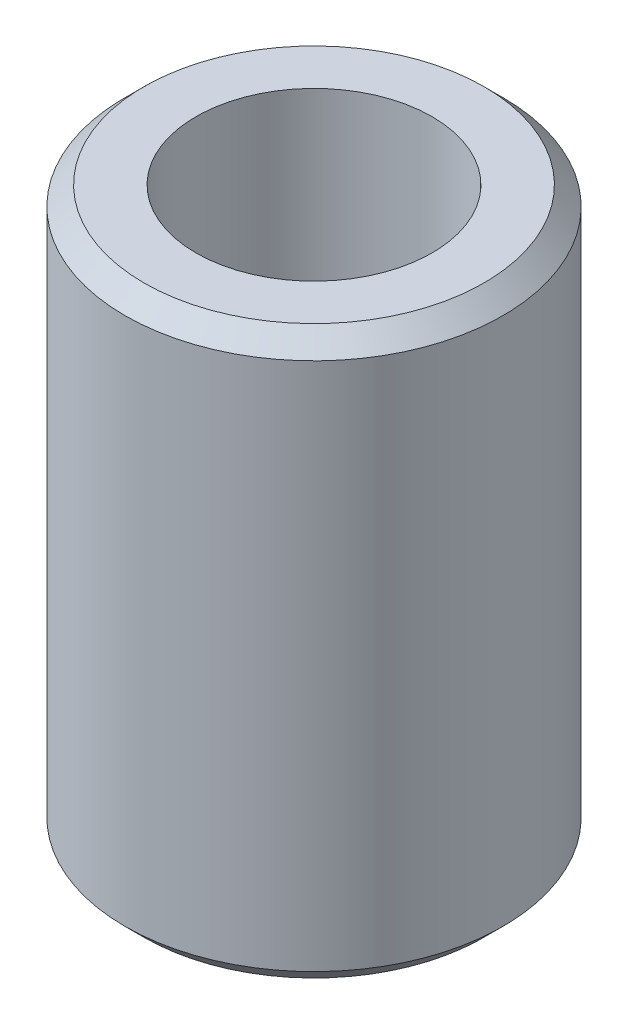
ISO-10303-21;
HEADER;
FILE_DESCRIPTION(('STEP AP214'),'2;1');
FILE_NAME('part.step','',(''),(''),'','','');
FILE_SCHEMA(('AUTOMOTIVE_DESIGN { 1 0 10303 214 1 1 1 1 }'));
ENDSEC;
DATA;
#1=APPLICATION_CONTEXT('core data for automotive mechanical design processes');
#2=APPLICATION_PROTOCOL_DEFINITION('international standard','automotive_design',2000,#1);
#3=PRODUCT_CONTEXT('',#1,'mechanical');
#4=PRODUCT('Part','Part','',(#3));
#5=PRODUCT_RELATED_PRODUCT_CATEGORY('part','',(#4));
#6=PRODUCT_DEFINITION_FORMATION('','',#4);
#7=PRODUCT_DEFINITION_CONTEXT('part definition',#1,'design');
#8=PRODUCT_DEFINITION('design','',#6,#7);
#9=PRODUCT_DEFINITION_SHAPE('','',#8);
#10=(LENGTH_UNIT() NAMED_UNIT(*) SI_UNIT(.MILLI.,.METRE.));
#11=(NAMED_UNIT(*) PLANE_ANGLE_UNIT() SI_UNIT($,.RADIAN.));
#12=(NAMED_UNIT(*) SI_UNIT($,.STERADIAN.) SOLID_ANGLE_UNIT());
#13=UNCERTAINTY_MEASURE_WITH_UNIT(LENGTH_MEASURE(1.E-05),#10,'distance_accuracy_value','');
#14=(GEOMETRIC_REPRESENTATION_CONTEXT(3) GLOBAL_UNCERTAINTY_ASSIGNED_CONTEXT((#13)) GLOBAL_UNIT_ASSIGNED_CONTEXT((#10,
#11,#12)) REPRESENTATION_CONTEXT('',''));
#15=CARTESIAN_POINT('',(0.,0.,0.));
#16=DIRECTION('',(0.,0.,1.));
#17=DIRECTION('',(1.,0.,0.));
#18=AXIS2_PLACEMENT_3D('',#15,#16,#17);
#19=CARTESIAN_POINT('',(0.,60.,0.));
#20=DIRECTION('',(0.,-1.,0.));
#21=DIRECTION('',(0.,0.,-1.));
#22=AXIS2_PLACEMENT_3D('',#19,#20,#21);
#23=CYLINDRICAL_SURFACE('',#22,20.);
#24=CARTESIAN_POINT('',(0.,2.,0.));
#25=DIRECTION('',(0.,1.,0.));
#26=DIRECTION('',(0.,0.,1.));
#27=AXIS2_PLACEMENT_3D('',#24,#25,#26);
#28=CIRCLE('',#27,20.);
#29=CARTESIAN_POINT('',(0.,2.,20.));
#30=VERTEX_POINT('',#29);
#31=EDGE_CURVE('E49',#30,#30,#28,.T.);
#32=ORIENTED_EDGE('',*,*,#31,.T.);
#33=EDGE_LOOP('',(#32));
#34=FACE_BOUND('',#33,.T.);
#35=CARTESIAN_POINT('',(0.,58.,0.));
#36=DIRECTION('',(0.,1.,0.));
#37=DIRECTION('',(0.,0.,1.));
#38=AXIS2_PLACEMENT_3D('',#35,#36,#37);
#39=CIRCLE('',#38,20.);
#40=CARTESIAN_POINT('',(0.,58.,20.));
#41=VERTEX_POINT('',#40);
#42=EDGE_CURVE('E53',#41,#41,#39,.F.);
#43=ORIENTED_EDGE('',*,*,#42,.T.);
#44=EDGE_LOOP('',(#43));
#45=FACE_BOUND('',#44,.T.);
#46=ADVANCED_FACE('F37',(#34,#45),#23,.T.);
#47=CARTESIAN_POINT('',(0.,60.,0.));
#48=DIRECTION('',(0.,1.,0.));
#49=DIRECTION('',(0.,0.,1.));
#50=AXIS2_PLACEMENT_3D('',#47,#48,#49);
#51=PLANE('',#50);
#52=CARTESIAN_POINT('',(0.,60.,0.));
#53=DIRECTION('',(0.,1.,0.));
#54=DIRECTION('',(0.,0.,1.));
#55=AXIS2_PLACEMENT_3D('',#52,#53,#54);
#56=CIRCLE('',#55,18.);
#57=CARTESIAN_POINT('',(0.,60.,18.));
#58=VERTEX_POINT('',#57);
#59=EDGE_CURVE('E10',#58,#58,#56,.T.);
#60=ORIENTED_EDGE('',*,*,#59,.T.);
#61=EDGE_LOOP('',(#60));
#62=FACE_BOUND('',#61,.T.);
#63=CARTESIAN_POINT('',(0.,60.,0.));
#64=DIRECTION('',(0.,1.,0.));
#65=DIRECTION('',(0.,0.,1.));
#66=AXIS2_PLACEMENT_3D('',#63,#64,#65);
#67=CIRCLE('',#66,12.5);
#68=CARTESIAN_POINT('',(0.,60.,12.5));
#69=VERTEX_POINT('',#68);
#70=EDGE_CURVE('E59',#69,#69,#67,.T.);
#71=ORIENTED_EDGE('',*,*,#70,.F.);
#72=EDGE_LOOP('',(#71));
#73=FACE_BOUND('',#72,.T.);
#74=ADVANCED_FACE('F74',(#62,#73),#51,.T.);
#75=CARTESIAN_POINT('',(0.,0.,0.));
#76=DIRECTION('',(0.,1.,0.));
#77=DIRECTION('',(0.,0.,1.));
#78=AXIS2_PLACEMENT_3D('',#75,#76,#77);
#79=PLANE('',#78);
#80=CARTESIAN_POINT('',(0.,0.,0.));
#81=DIRECTION('',(0.,1.,0.));
#82=DIRECTION('',(0.,0.,1.));
#83=AXIS2_PLACEMENT_3D('',#80,#81,#82);
#84=CIRCLE('',#83,18.);
#85=CARTESIAN_POINT('',(0.,0.,18.));
#86=VERTEX_POINT('',#85);
#87=EDGE_CURVE('E45',#86,#86,#84,.F.);
#88=ORIENTED_EDGE('',*,*,#87,.T.);
#89=EDGE_LOOP('',(#88));
#90=FACE_BOUND('',#89,.T.);
#91=CARTESIAN_POINT('',(0.,0.,0.));
#92=DIRECTION('',(0.,1.,0.));
#93=DIRECTION('',(0.,0.,1.));
#94=AXIS2_PLACEMENT_3D('',#91,#92,#93);
#95=CIRCLE('',#94,12.5);
#96=CARTESIAN_POINT('',(0.,0.,12.5));
#97=VERTEX_POINT('',#96);
#98=EDGE_CURVE('E58',#97,#97,#95,.T.);
#99=ORIENTED_EDGE('',*,*,#98,.T.);
#100=EDGE_LOOP('',(#99));
#101=FACE_BOUND('',#100,.T.);
#102=ADVANCED_FACE('F65',(#90,#101),#79,.F.);
#103=CARTESIAN_POINT('',(0.,0.,0.));
#104=DIRECTION('',(0.,1.,0.));
#105=DIRECTION('',(0.,0.,1.));
#106=AXIS2_PLACEMENT_3D('',#103,#104,#105);
#107=CYLINDRICAL_SURFACE('',#106,12.5);
#108=ORIENTED_EDGE('',*,*,#98,.F.);
#109=EDGE_LOOP('',(#108));
#110=FACE_BOUND('',#109,.T.);
#111=ORIENTED_EDGE('',*,*,#70,.T.);
#112=EDGE_LOOP('',(#111));
#113=FACE_BOUND('',#112,.T.);
#114=ADVANCED_FACE('F67',(#110,#113),#107,.F.);
#115=CARTESIAN_POINT('',(0.,2.,0.));
#116=DIRECTION('',(0.,1.,0.));
#117=DIRECTION('',(0.,0.,1.));
#118=AXIS2_PLACEMENT_3D('',#115,#116,#117);
#119=CONICAL_SURFACE('',#118,20.,0.785398163397449);
#120=ORIENTED_EDGE('',*,*,#87,.F.);
#121=EDGE_LOOP('',(#120));
#122=FACE_BOUND('',#121,.T.);
#123=ORIENTED_EDGE('',*,*,#31,.F.);
#124=EDGE_LOOP('',(#123));
#125=FACE_BOUND('',#124,.T.);
#126=ADVANCED_FACE('F70',(#122,#125),#119,.T.);
#127=CARTESIAN_POINT('',(0.,60.,0.));
#128=DIRECTION('',(0.,-1.,0.));
#129=DIRECTION('',(0.,0.,-1.));
#130=AXIS2_PLACEMENT_3D('',#127,#128,#129);
#131=CONICAL_SURFACE('',#130,18.,0.785398163397449);
#132=ORIENTED_EDGE('',*,*,#42,.F.);
#133=EDGE_LOOP('',(#132));
#134=FACE_BOUND('',#133,.T.);
#135=ORIENTED_EDGE('',*,*,#59,.F.);
#136=EDGE_LOOP('',(#135));
#137=FACE_BOUND('',#136,.T.);
#138=ADVANCED_FACE('F40',(#134,#137),#131,.T.);
#139=CLOSED_SHELL('',(#46,#74,#102,#114,#126,#138));
#140=MANIFOLD_SOLID_BREP('B2',#139);
#141=ADVANCED_BREP_SHAPE_REPRESENTATION('',(#18,#140),#14);
#142=SHAPE_DEFINITION_REPRESENTATION(#9,#141);
ENDSEC;
END-ISO-10303-21;
